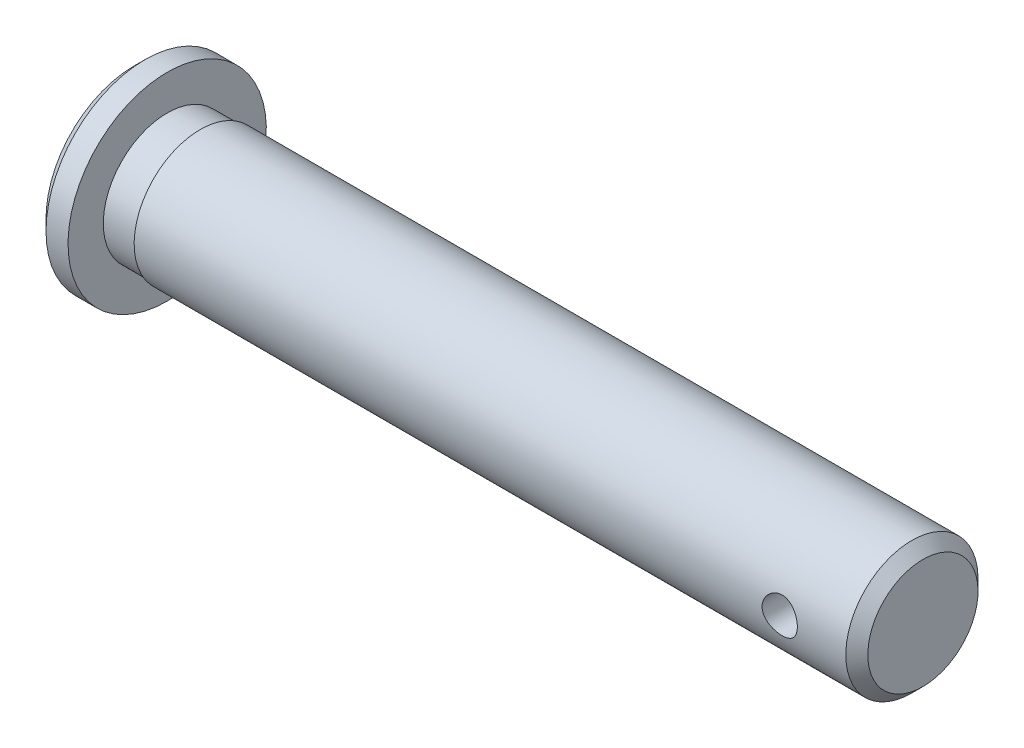
ISO-10303-21;
HEADER;
FILE_DESCRIPTION(('STEP AP214'),'2;1');
FILE_NAME('part.step','',(''),(''),'','','');
FILE_SCHEMA(('AUTOMOTIVE_DESIGN { 1 0 10303 214 1 1 1 1 }'));
ENDSEC;
DATA;
#1=APPLICATION_CONTEXT('core data for automotive mechanical design processes');
#2=APPLICATION_PROTOCOL_DEFINITION('international standard','automotive_design',2000,#1);
#3=PRODUCT_CONTEXT('',#1,'mechanical');
#4=PRODUCT('Part','Part','',(#3));
#5=PRODUCT_RELATED_PRODUCT_CATEGORY('part','',(#4));
#6=PRODUCT_DEFINITION_FORMATION('','',#4);
#7=PRODUCT_DEFINITION_CONTEXT('part definition',#1,'design');
#8=PRODUCT_DEFINITION('design','',#6,#7);
#9=PRODUCT_DEFINITION_SHAPE('','',#8);
#10=(LENGTH_UNIT() NAMED_UNIT(*) SI_UNIT(.MILLI.,.METRE.));
#11=(NAMED_UNIT(*) PLANE_ANGLE_UNIT() SI_UNIT($,.RADIAN.));
#12=(NAMED_UNIT(*) SI_UNIT($,.STERADIAN.) SOLID_ANGLE_UNIT());
#13=UNCERTAINTY_MEASURE_WITH_UNIT(LENGTH_MEASURE(1.E-05),#10,'distance_accuracy_value','');
#14=(GEOMETRIC_REPRESENTATION_CONTEXT(3) GLOBAL_UNCERTAINTY_ASSIGNED_CONTEXT((#13)) GLOBAL_UNIT_ASSIGNED_CONTEXT((#10,
#11,#12)) REPRESENTATION_CONTEXT('',''));
#15=CARTESIAN_POINT('',(0.,0.,0.));
#16=DIRECTION('',(0.,0.,1.));
#17=DIRECTION('',(1.,0.,0.));
#18=AXIS2_PLACEMENT_3D('',#15,#16,#17);
#19=CARTESIAN_POINT('',(-1.5,0.,0.));
#20=DIRECTION('',(1.,0.,0.));
#21=DIRECTION('',(0.,1.,0.));
#22=AXIS2_PLACEMENT_3D('',#19,#20,#21);
#23=PLANE('',#22);
#24=CARTESIAN_POINT('',(-1.5,0.,0.));
#25=DIRECTION('',(1.,0.,0.));
#26=DIRECTION('',(0.,1.,0.));
#27=AXIS2_PLACEMENT_3D('',#24,#25,#26);
#28=CIRCLE('',#27,4.);
#29=CARTESIAN_POINT('',(-1.5,4.,0.));
#30=VERTEX_POINT('',#29);
#31=EDGE_CURVE('E42',#30,#30,#28,.F.);
#32=ORIENTED_EDGE('',*,*,#31,.T.);
#33=EDGE_LOOP('',(#32));
#34=FACE_BOUND('',#33,.T.);
#35=ADVANCED_FACE('F35',(#34),#23,.F.);
#36=CARTESIAN_POINT('',(0.,0.,0.));
#37=DIRECTION('',(-1.,0.,0.));
#38=DIRECTION('',(0.,-1.,0.));
#39=AXIS2_PLACEMENT_3D('',#36,#37,#38);
#40=CYLINDRICAL_SURFACE('',#39,4.5);
#41=CARTESIAN_POINT('',(-1.,0.,0.));
#42=DIRECTION('',(1.,0.,0.));
#43=DIRECTION('',(0.,1.,0.));
#44=AXIS2_PLACEMENT_3D('',#41,#42,#43);
#45=CIRCLE('',#44,4.5);
#46=CARTESIAN_POINT('',(-1.,4.5,0.));
#47=VERTEX_POINT('',#46);
#48=EDGE_CURVE('E10',#47,#47,#45,.T.);
#49=ORIENTED_EDGE('',*,*,#48,.T.);
#50=EDGE_LOOP('',(#49));
#51=FACE_BOUND('',#50,.T.);
#52=CARTESIAN_POINT('',(0.,0.,0.));
#53=DIRECTION('',(-1.,0.,0.));
#54=DIRECTION('',(0.,-1.,0.));
#55=AXIS2_PLACEMENT_3D('',#52,#53,#54);
#56=CIRCLE('',#55,4.5);
#57=CARTESIAN_POINT('',(0.,-4.5,0.));
#58=VERTEX_POINT('',#57);
#59=EDGE_CURVE('E119',#58,#58,#56,.T.);
#60=ORIENTED_EDGE('',*,*,#59,.T.);
#61=EDGE_LOOP('',(#60));
#62=FACE_BOUND('',#61,.T.);
#63=ADVANCED_FACE('F86',(#51,#62),#40,.T.);
#64=CARTESIAN_POINT('',(0.,4.5,0.));
#65=DIRECTION('',(-1.,0.,0.));
#66=DIRECTION('',(0.,-1.,0.));
#67=AXIS2_PLACEMENT_3D('',#64,#65,#66);
#68=PLANE('',#67);
#69=ORIENTED_EDGE('',*,*,#59,.F.);
#70=EDGE_LOOP('',(#69));
#71=FACE_BOUND('',#70,.T.);
#72=CARTESIAN_POINT('',(0.,0.,0.));
#73=DIRECTION('',(-1.,0.,0.));
#74=DIRECTION('',(0.,-1.,0.));
#75=AXIS2_PLACEMENT_3D('',#72,#73,#74);
#76=CIRCLE('',#75,2.9);
#77=CARTESIAN_POINT('',(0.,-2.9,0.));
#78=VERTEX_POINT('',#77);
#79=EDGE_CURVE('E115',#78,#78,#76,.T.);
#80=ORIENTED_EDGE('',*,*,#79,.T.);
#81=EDGE_LOOP('',(#80));
#82=FACE_BOUND('',#81,.T.);
#83=ADVANCED_FACE('F91',(#71,#82),#68,.F.);
#84=CARTESIAN_POINT('',(0.,0.,0.));
#85=DIRECTION('',(-1.,0.,0.));
#86=DIRECTION('',(0.,-1.,0.));
#87=AXIS2_PLACEMENT_3D('',#84,#85,#86);
#88=CYLINDRICAL_SURFACE('',#87,2.9);
#89=ORIENTED_EDGE('',*,*,#79,.F.);
#90=EDGE_LOOP('',(#89));
#91=FACE_BOUND('',#90,.T.);
#92=CARTESIAN_POINT('',(1.5,0.,0.));
#93=DIRECTION('',(-1.,0.,0.));
#94=DIRECTION('',(0.,-1.,0.));
#95=AXIS2_PLACEMENT_3D('',#92,#93,#94);
#96=CIRCLE('',#95,2.9);
#97=CARTESIAN_POINT('',(1.5,-2.9,0.));
#98=VERTEX_POINT('',#97);
#99=EDGE_CURVE('E112',#98,#98,#96,.T.);
#100=ORIENTED_EDGE('',*,*,#99,.T.);
#101=EDGE_LOOP('',(#100));
#102=FACE_BOUND('',#101,.T.);
#103=ADVANCED_FACE('F126',(#91,#102),#88,.T.);
#104=CARTESIAN_POINT('',(1.5,2.9,0.));
#105=DIRECTION('',(1.,0.,0.));
#106=DIRECTION('',(0.,1.,0.));
#107=AXIS2_PLACEMENT_3D('',#104,#105,#106);
#108=PLANE('',#107);
#109=ORIENTED_EDGE('',*,*,#99,.F.);
#110=EDGE_LOOP('',(#109));
#111=FACE_BOUND('',#110,.T.);
#112=CARTESIAN_POINT('',(1.5,0.,0.));
#113=DIRECTION('',(-1.,0.,0.));
#114=DIRECTION('',(0.,-1.,0.));
#115=AXIS2_PLACEMENT_3D('',#112,#113,#114);
#116=CIRCLE('',#115,3.);
#117=CARTESIAN_POINT('',(1.5,-3.,0.));
#118=VERTEX_POINT('',#117);
#119=EDGE_CURVE('E63',#118,#118,#116,.T.);
#120=ORIENTED_EDGE('',*,*,#119,.T.);
#121=EDGE_LOOP('',(#120));
#122=FACE_BOUND('',#121,.T.);
#123=ADVANCED_FACE('F83',(#111,#122),#108,.F.);
#124=CARTESIAN_POINT('',(0.,0.,0.));
#125=DIRECTION('',(-1.,0.,0.));
#126=DIRECTION('',(0.,-1.,0.));
#127=AXIS2_PLACEMENT_3D('',#124,#125,#126);
#128=CYLINDRICAL_SURFACE('',#127,3.);
#129=CARTESIAN_POINT('',(33.8,0.,0.));
#130=DIRECTION('',(-1.,0.,0.));
#131=DIRECTION('',(0.,-1.,0.));
#132=AXIS2_PLACEMENT_3D('',#129,#130,#131);
#133=CIRCLE('',#132,3.);
#134=CARTESIAN_POINT('',(33.8,-3.,0.));
#135=VERTEX_POINT('',#134);
#136=EDGE_CURVE('E50',#135,#135,#133,.T.);
#137=ORIENTED_EDGE('',*,*,#136,.T.);
#138=EDGE_LOOP('',(#137));
#139=FACE_BOUND('',#138,.T.);
#140=CARTESIAN_POINT('',(31.6,0.,-3.));
#141=CARTESIAN_POINT('',(31.5999989532261,0.0441018223331418,-2.99999933524065));
#142=CARTESIAN_POINT('',(31.5963409543241,0.0882148640887363,-2.99901794464862));
#143=CARTESIAN_POINT('',(31.5818315077045,0.175170180541786,-2.99519829448663));
#144=CARTESIAN_POINT('',(31.5709765982296,0.218011833327636,-2.9923591413303));
#145=CARTESIAN_POINT('',(31.5424513332544,0.301156635618128,-2.98513733301121));
#146=CARTESIAN_POINT('',(31.5247897649336,0.341462980406118,-2.98075666852169));
#147=CARTESIAN_POINT('',(31.4831851029334,0.418541474557067,-2.97091479660652));
#148=CARTESIAN_POINT('',(31.4592415906563,0.455313388179853,-2.96545351718002));
#149=CARTESIAN_POINT('',(31.4051665934346,0.525131801496016,-2.95389845960869));
#150=CARTESIAN_POINT('',(31.3749165327966,0.558084675945132,-2.9477938707174));
#151=CARTESIAN_POINT('',(31.3093406067747,0.618514854642545,-2.93570963871569));
#152=CARTESIAN_POINT('',(31.2740140889533,0.645991453982621,-2.92973001177899));
#153=CARTESIAN_POINT('',(31.1985407060695,0.695145636973708,-2.91846214986765));
#154=CARTESIAN_POINT('',(31.1583214686941,0.716715510946115,-2.91318755429117));
#155=CARTESIAN_POINT('',(31.0746639555642,0.752750192307824,-2.90408590923454));
#156=CARTESIAN_POINT('',(31.0312262750719,0.767216309804888,-2.9002585928704));
#157=CARTESIAN_POINT('',(30.9434017848693,0.788307680905708,-2.89459646334927));
#158=CARTESIAN_POINT('',(30.8990585840191,0.795102680979751,-2.89271859176123));
#159=CARTESIAN_POINT('',(30.8098249266668,0.801188138824376,-2.89103932417876));
#160=CARTESIAN_POINT('',(30.7649345739857,0.800479998822949,-2.89123754019361));
#161=CARTESIAN_POINT('',(30.6772058338511,0.79171404001049,-2.89364951507618));
#162=CARTESIAN_POINT('',(30.6343451271848,0.783861624258981,-2.89580694201076));
#163=CARTESIAN_POINT('',(30.5505726662173,0.761358994888821,-2.90180405235812));
#164=CARTESIAN_POINT('',(30.5096610679698,0.746708237972008,-2.90564387021998));
#165=CARTESIAN_POINT('',(30.4304127424766,0.710857427861006,-2.91462264698391));
#166=CARTESIAN_POINT('',(30.3921102642855,0.689585364551136,-2.91977577127223));
#167=CARTESIAN_POINT('',(30.3195463364594,0.641146015295121,-2.93079291857236));
#168=CARTESIAN_POINT('',(30.2852856843374,0.613977568897012,-2.93665708142145));
#169=CARTESIAN_POINT('',(30.2206044010181,0.553466429053678,-2.94867004251873));
#170=CARTESIAN_POINT('',(30.190345472674,0.5199512509132,-2.95482188595513));
#171=CARTESIAN_POINT('',(30.1358444878599,0.448247067282552,-2.96654552510546));
#172=CARTESIAN_POINT('',(30.111602668519,0.410057877682038,-2.97211729795427));
#173=CARTESIAN_POINT('',(30.0697528388701,0.329839302198981,-2.98208728159312));
#174=CARTESIAN_POINT('',(30.0521740918206,0.287793961020717,-2.98648029133423));
#175=CARTESIAN_POINT('',(30.0243811244746,0.20120091775616,-2.99356017760401));
#176=CARTESIAN_POINT('',(30.0141652949104,0.15665376477133,-2.996247426935));
#177=CARTESIAN_POINT('',(30.0016420492329,0.067701633258206,-2.99955663423354));
#178=CARTESIAN_POINT('',(29.9991147840596,0.0233296950565515,-3.00023598988385));
#179=CARTESIAN_POINT('',(30.0014332656988,-0.0652040183604805,-2.99961788676677));
#180=CARTESIAN_POINT('',(30.0062782504423,-0.109365814824846,-2.99832063232137));
#181=CARTESIAN_POINT('',(30.023023378984,-0.195440979960715,-2.99393214198412));
#182=CARTESIAN_POINT('',(30.0348008984791,-0.237379940811119,-2.99087210618547));
#183=CARTESIAN_POINT('',(30.0649343778032,-0.318682788470426,-2.98330517957641));
#184=CARTESIAN_POINT('',(30.0832910505002,-0.358046395686402,-2.9787981319841));
#185=CARTESIAN_POINT('',(30.1264695548722,-0.433935389867197,-2.96870264223867));
#186=CARTESIAN_POINT('',(30.1514109867192,-0.470390075384524,-2.96309474642193));
#187=CARTESIAN_POINT('',(30.2069006520631,-0.538673854158816,-2.95144580946015));
#188=CARTESIAN_POINT('',(30.2374499930399,-0.570502031519501,-2.94540468290222));
#189=CARTESIAN_POINT('',(30.3043142309983,-0.62955569791528,-2.9333589834749));
#190=CARTESIAN_POINT('',(30.3407674245601,-0.656626076999949,-2.92736024574782));
#191=CARTESIAN_POINT('',(30.4178258784379,-0.7042687647398,-2.91626578870035));
#192=CARTESIAN_POINT('',(30.4584309654415,-0.724841344486113,-2.91117003171109));
#193=CARTESIAN_POINT('',(30.5424381228353,-0.75874964634595,-2.9025170736066));
#194=CARTESIAN_POINT('',(30.5858223247492,-0.772127249023596,-2.89895099369493));
#195=CARTESIAN_POINT('',(30.6743357278935,-0.791364820483178,-2.89375930092876));
#196=CARTESIAN_POINT('',(30.7194644801468,-0.797226710411958,-2.89213319219128));
#197=CARTESIAN_POINT('',(30.808597915149,-0.801155958613018,-2.89104697818674));
#198=CARTESIAN_POINT('',(30.8525909281021,-0.799472622471947,-2.89151759094413));
#199=CARTESIAN_POINT('',(30.9396414056052,-0.788937504002255,-2.89440958435318));
#200=CARTESIAN_POINT('',(30.9826988942006,-0.780085906140239,-2.89683091480545));
#201=CARTESIAN_POINT('',(31.0663423008516,-0.755610062798671,-2.903310284285));
#202=CARTESIAN_POINT('',(31.1069447370928,-0.740038644302289,-2.90735554007653));
#203=CARTESIAN_POINT('',(31.1849915322137,-0.702606218249584,-2.91662727254676));
#204=CARTESIAN_POINT('',(31.2224353945202,-0.680744224098481,-2.92185393448601));
#205=CARTESIAN_POINT('',(31.2942921437986,-0.630595637075262,-2.93309168576127));
#206=CARTESIAN_POINT('',(31.3285834139905,-0.602138919071638,-2.93912133240661));
#207=CARTESIAN_POINT('',(31.3919849806669,-0.539932214044405,-2.95118201513218));
#208=CARTESIAN_POINT('',(31.4210940154675,-0.506180941743502,-2.95721305119381));
#209=CARTESIAN_POINT('',(31.4739168950587,-0.433471992435476,-2.96875124961583));
#210=CARTESIAN_POINT('',(31.4975020042597,-0.394418384700713,-2.97424444525819));
#211=CARTESIAN_POINT('',(31.5377349663718,-0.312755456166756,-2.9839352404116));
#212=CARTESIAN_POINT('',(31.5543872702654,-0.270148437878518,-2.98813367073438));
#213=CARTESIAN_POINT('',(31.5781101141662,-0.189749881952395,-2.99421901005387));
#214=CARTESIAN_POINT('',(31.586299753437,-0.152304806626013,-2.99637108237041));
#215=CARTESIAN_POINT('',(31.5972448824668,-0.07657591812683,-2.99926179614582));
#216=CARTESIAN_POINT('',(31.60000090888,-0.0382921881619439,-3.00000057718908));
#217=CARTESIAN_POINT('',(31.6,0.,-3.));
#218=B_SPLINE_CURVE_WITH_KNOTS('',3,(#140,#141,#142,#143,#144,#145,#146,#147,#148,#149,#150,
#151,#152,#153,#154,#155,#156,#157,#158,#159,#160,#161,#162,#163,#164,#165,#166,#167,#168,#169,
#170,#171,#172,#173,#174,#175,#176,#177,#178,#179,#180,#181,#182,#183,#184,#185,#186,#187,#188,
#189,#190,#191,#192,#193,#194,#195,#196,#197,#198,#199,#200,#201,#202,#203,#204,#205,#206,#207,
#208,#209,#210,#211,#212,#213,#214,#215,#216,#217),.UNSPECIFIED.,.T.,.F.,(4,2,2,2,2,2,2,2,2,2,2,
2,2,2,2,2,2,2,2,2,2,2,2,2,2,2,2,2,2,2,2,2,2,2,2,2,2,2,4),(0.,0.132165039579828,
0.264393697504582,0.396452221188776,0.528519546834705,0.663339591819877,0.7981769797006,
0.935330330092926,1.07245837651881,1.20648863299037,1.34049384159395,1.47076400816065,
1.60104458722843,1.73279469336266,1.86457075244719,2.00064503922596,2.13672468772706,
2.27339523838884,2.41003590873723,2.54273087007487,2.67541211567808,2.80581414254514,
2.93623030307914,3.06920114399488,3.20219827301223,3.33894598550784,3.47568799207311,
3.61162519076598,3.74752763461534,3.87897336957385,4.01041572204179,4.14084306175262,
4.27129086845142,4.40557735824497,4.5398964972892,4.677089009083,4.81419330454013,
4.92895927593276,5.04371391182494),.UNSPECIFIED.);
#219=CARTESIAN_POINT('',(31.6,0.,-3.));
#220=VERTEX_POINT('',#219);
#221=EDGE_CURVE('E56',#220,#220,#218,.T.);
#222=ORIENTED_EDGE('',*,*,#221,.T.);
#223=EDGE_LOOP('',(#222));
#224=FACE_BOUND('',#223,.T.);
#225=CARTESIAN_POINT('',(31.6,0.,3.));
#226=CARTESIAN_POINT('',(31.5999989532261,-0.044101822333143,2.99999933524065));
#227=CARTESIAN_POINT('',(31.5963409543241,-0.0882148640887375,2.99901794464862));
#228=CARTESIAN_POINT('',(31.5818315077045,-0.175170180541788,2.99519829448663));
#229=CARTESIAN_POINT('',(31.5709765982296,-0.218011833327638,2.9923591413303));
#230=CARTESIAN_POINT('',(31.5424513332544,-0.301156635618129,2.98513733301121));
#231=CARTESIAN_POINT('',(31.5247897649336,-0.341462980406119,2.98075666852169));
#232=CARTESIAN_POINT('',(31.4831851029334,-0.418541474557068,2.97091479660652));
#233=CARTESIAN_POINT('',(31.4592415906563,-0.455313388179853,2.96545351718002));
#234=CARTESIAN_POINT('',(31.4051665934346,-0.525131801496017,2.95389845960869));
#235=CARTESIAN_POINT('',(31.3749165327966,-0.558084675945133,2.9477938707174));
#236=CARTESIAN_POINT('',(31.3093406067747,-0.618514854642547,2.93570963871569));
#237=CARTESIAN_POINT('',(31.2740140889533,-0.645991453982624,2.92973001177898));
#238=CARTESIAN_POINT('',(31.1985407060695,-0.69514563697371,2.91846214986764));
#239=CARTESIAN_POINT('',(31.1583214686941,-0.716715510946116,2.91318755429117));
#240=CARTESIAN_POINT('',(31.0746639555642,-0.752750192307824,2.90408590923454));
#241=CARTESIAN_POINT('',(31.0312262750719,-0.767216309804887,2.9002585928704));
#242=CARTESIAN_POINT('',(30.9434017848693,-0.788307680905707,2.89459646334927));
#243=CARTESIAN_POINT('',(30.8990585840191,-0.795102680979751,2.89271859176123));
#244=CARTESIAN_POINT('',(30.8098249266668,-0.801188138824376,2.89103932417876));
#245=CARTESIAN_POINT('',(30.7649345739857,-0.80047999882295,2.89123754019361));
#246=CARTESIAN_POINT('',(30.6772058338511,-0.79171404001049,2.89364951507618));
#247=CARTESIAN_POINT('',(30.6343451271848,-0.783861624258981,2.89580694201076));
#248=CARTESIAN_POINT('',(30.5505726662173,-0.761358994888821,2.90180405235812));
#249=CARTESIAN_POINT('',(30.5096610679698,-0.746708237972008,2.90564387021998));
#250=CARTESIAN_POINT('',(30.4304127424766,-0.710857427861006,2.91462264698391));
#251=CARTESIAN_POINT('',(30.3921102642855,-0.689585364551136,2.91977577127223));
#252=CARTESIAN_POINT('',(30.3195463364594,-0.64114601529512,2.93079291857236));
#253=CARTESIAN_POINT('',(30.2852856843374,-0.61397756889701,2.93665708142145));
#254=CARTESIAN_POINT('',(30.2206044010181,-0.553466429053675,2.94867004251873));
#255=CARTESIAN_POINT('',(30.190345472674,-0.519951250913196,2.95482188595513));
#256=CARTESIAN_POINT('',(30.1358444878599,-0.44824706728255,2.96654552510546));
#257=CARTESIAN_POINT('',(30.111602668519,-0.410057877682037,2.97211729795427));
#258=CARTESIAN_POINT('',(30.0697528388701,-0.329839302198981,2.98208728159312));
#259=CARTESIAN_POINT('',(30.0521740918206,-0.287793961020715,2.98648029133423));
#260=CARTESIAN_POINT('',(30.0243811244746,-0.201200917756157,2.99356017760401));
#261=CARTESIAN_POINT('',(30.0141652949104,-0.156653764771328,2.996247426935));
#262=CARTESIAN_POINT('',(30.0016420492329,-0.0677016332582041,2.99955663423354));
#263=CARTESIAN_POINT('',(29.9991147840596,-0.0233296950565494,3.00023598988385));
#264=CARTESIAN_POINT('',(30.0014332656988,0.0652040183604825,2.99961788676677));
#265=CARTESIAN_POINT('',(30.0062782504423,0.109365814824848,2.99832063232137));
#266=CARTESIAN_POINT('',(30.023023378984,0.195440979960717,2.99393214198412));
#267=CARTESIAN_POINT('',(30.0348008984791,0.237379940811121,2.99087210618547));
#268=CARTESIAN_POINT('',(30.0649343778032,0.318682788470428,2.98330517957641));
#269=CARTESIAN_POINT('',(30.0832910505002,0.358046395686404,2.9787981319841));
#270=CARTESIAN_POINT('',(30.1264695548722,0.433935389867198,2.96870264223867));
#271=CARTESIAN_POINT('',(30.1514109867192,0.470390075384525,2.96309474642193));
#272=CARTESIAN_POINT('',(30.2069006520631,0.538673854158818,2.95144580946015));
#273=CARTESIAN_POINT('',(30.2374499930399,0.570502031519503,2.94540468290222));
#274=CARTESIAN_POINT('',(30.3043142309983,0.629555697915281,2.9333589834749));
#275=CARTESIAN_POINT('',(30.3407674245601,0.65662607699995,2.92736024574781));
#276=CARTESIAN_POINT('',(30.4178258784379,0.7042687647398,2.91626578870034));
#277=CARTESIAN_POINT('',(30.4584309654415,0.724841344486114,2.91117003171109));
#278=CARTESIAN_POINT('',(30.5424381228353,0.75874964634595,2.9025170736066));
#279=CARTESIAN_POINT('',(30.5858223247492,0.772127249023596,2.89895099369493));
#280=CARTESIAN_POINT('',(30.6743357278935,0.791364820483178,2.89375930092876));
#281=CARTESIAN_POINT('',(30.7194644801468,0.797226710411958,2.89213319219128));
#282=CARTESIAN_POINT('',(30.808597915149,0.801155958613018,2.89104697818674));
#283=CARTESIAN_POINT('',(30.8525909281021,0.799472622471946,2.89151759094413));
#284=CARTESIAN_POINT('',(30.9396414056052,0.788937504002255,2.89440958435317));
#285=CARTESIAN_POINT('',(30.9826988942006,0.780085906140239,2.89683091480545));
#286=CARTESIAN_POINT('',(31.0663423008516,0.755610062798671,2.903310284285));
#287=CARTESIAN_POINT('',(31.1069447370928,0.740038644302289,2.90735554007653));
#288=CARTESIAN_POINT('',(31.1849915322137,0.702606218249583,2.91662727254676));
#289=CARTESIAN_POINT('',(31.2224353945202,0.680744224098481,2.92185393448601));
#290=CARTESIAN_POINT('',(31.2942921437986,0.630595637075262,2.93309168576127));
#291=CARTESIAN_POINT('',(31.3285834139905,0.602138919071638,2.93912133240661));
#292=CARTESIAN_POINT('',(31.3919849806669,0.539932214044402,2.95118201513218));
#293=CARTESIAN_POINT('',(31.4210940154675,0.506180941743496,2.95721305119381));
#294=CARTESIAN_POINT('',(31.4739168950587,0.433471992435468,2.96875124961583));
#295=CARTESIAN_POINT('',(31.4975020042597,0.394418384700707,2.97424444525819));
#296=CARTESIAN_POINT('',(31.5377349663718,0.312755456166753,2.9839352404116));
#297=CARTESIAN_POINT('',(31.5543872702654,0.270148437878516,2.98813367073438));
#298=CARTESIAN_POINT('',(31.5781101141662,0.189749881952394,2.99421901005387));
#299=CARTESIAN_POINT('',(31.586299753437,0.152304806626012,2.99637108237041));
#300=CARTESIAN_POINT('',(31.5972448824668,0.0765759181268288,2.99926179614582));
#301=CARTESIAN_POINT('',(31.60000090888,0.0382921881619427,3.00000057718908));
#302=CARTESIAN_POINT('',(31.6,0.,3.));
#303=B_SPLINE_CURVE_WITH_KNOTS('',3,(#225,#226,#227,#228,#229,#230,#231,#232,#233,#234,#235,
#236,#237,#238,#239,#240,#241,#242,#243,#244,#245,#246,#247,#248,#249,#250,#251,#252,#253,#254,
#255,#256,#257,#258,#259,#260,#261,#262,#263,#264,#265,#266,#267,#268,#269,#270,#271,#272,#273,
#274,#275,#276,#277,#278,#279,#280,#281,#282,#283,#284,#285,#286,#287,#288,#289,#290,#291,#292,
#293,#294,#295,#296,#297,#298,#299,#300,#301,#302),.UNSPECIFIED.,.T.,.F.,(4,2,2,2,2,2,2,2,2,2,2,
2,2,2,2,2,2,2,2,2,2,2,2,2,2,2,2,2,2,2,2,2,2,2,2,2,2,2,4),(0.,0.132165039579828,
0.264393697504583,0.396452221188776,0.528519546834704,0.663339591819877,0.798176979700607,
0.935330330092925,1.07245837651881,1.20648863299036,1.34049384159395,1.47076400816065,
1.60104458722843,1.73279469336266,1.8645707524472,2.00064503922596,2.13672468772706,
2.27339523838884,2.41003590873723,2.54273087007487,2.67541211567808,2.80581414254514,
2.93623030307914,3.06920114399488,3.20219827301223,3.33894598550784,3.47568799207311,
3.61162519076598,3.74752763461533,3.87897336957385,4.01041572204178,4.14084306175262,
4.27129086845142,4.40557735824497,4.53989649728921,4.677089009083,4.81419330454013,
4.92895927593276,5.04371391182494),.UNSPECIFIED.);
#304=CARTESIAN_POINT('',(31.6,0.,3.));
#305=VERTEX_POINT('',#304);
#306=EDGE_CURVE('E55',#305,#305,#303,.T.);
#307=ORIENTED_EDGE('',*,*,#306,.T.);
#308=EDGE_LOOP('',(#307));
#309=FACE_BOUND('',#308,.T.);
#310=ORIENTED_EDGE('',*,*,#119,.F.);
#311=EDGE_LOOP('',(#310));
#312=FACE_BOUND('',#311,.T.);
#313=ADVANCED_FACE('F67',(#139,#224,#309,#312),#128,.T.);
#314=CARTESIAN_POINT('',(34.3,3.,0.));
#315=DIRECTION('',(-1.,0.,0.));
#316=DIRECTION('',(0.,-1.,0.));
#317=AXIS2_PLACEMENT_3D('',#314,#315,#316);
#318=PLANE('',#317);
#319=CARTESIAN_POINT('',(34.3,0.,0.));
#320=DIRECTION('',(-1.,0.,0.));
#321=DIRECTION('',(0.,-1.,0.));
#322=AXIS2_PLACEMENT_3D('',#319,#320,#321);
#323=CIRCLE('',#322,2.5);
#324=CARTESIAN_POINT('',(34.3,-2.5,0.));
#325=VERTEX_POINT('',#324);
#326=EDGE_CURVE('E46',#325,#325,#323,.F.);
#327=ORIENTED_EDGE('',*,*,#326,.T.);
#328=EDGE_LOOP('',(#327));
#329=FACE_BOUND('',#328,.T.);
#330=ADVANCED_FACE('F75',(#329),#318,.F.);
#331=CARTESIAN_POINT('',(30.8,0.,-4.5));
#332=DIRECTION('',(0.,0.,1.));
#333=DIRECTION('',(1.,0.,0.));
#334=AXIS2_PLACEMENT_3D('',#331,#332,#333);
#335=CYLINDRICAL_SURFACE('',#334,0.800000000000006);
#336=ORIENTED_EDGE('',*,*,#221,.F.);
#337=EDGE_LOOP('',(#336));
#338=FACE_BOUND('',#337,.T.);
#339=ORIENTED_EDGE('',*,*,#306,.F.);
#340=EDGE_LOOP('',(#339));
#341=FACE_BOUND('',#340,.T.);
#342=ADVANCED_FACE('F71',(#338,#341),#335,.F.);
#343=CARTESIAN_POINT('',(33.8,0.,0.));
#344=DIRECTION('',(-1.,0.,0.));
#345=DIRECTION('',(0.,-1.,0.));
#346=AXIS2_PLACEMENT_3D('',#343,#344,#345);
#347=CONICAL_SURFACE('',#346,3.,0.785398163397447);
#348=ORIENTED_EDGE('',*,*,#326,.F.);
#349=EDGE_LOOP('',(#348));
#350=FACE_BOUND('',#349,.T.);
#351=ORIENTED_EDGE('',*,*,#136,.F.);
#352=EDGE_LOOP('',(#351));
#353=FACE_BOUND('',#352,.T.);
#354=ADVANCED_FACE('F74',(#350,#353),#347,.T.);
#355=CARTESIAN_POINT('',(-1.5,0.,0.));
#356=DIRECTION('',(1.,0.,0.));
#357=DIRECTION('',(0.,1.,0.));
#358=AXIS2_PLACEMENT_3D('',#355,#356,#357);
#359=CONICAL_SURFACE('',#358,4.,0.785398163397447);
#360=ORIENTED_EDGE('',*,*,#48,.F.);
#361=EDGE_LOOP('',(#360));
#362=FACE_BOUND('',#361,.T.);
#363=ORIENTED_EDGE('',*,*,#31,.F.);
#364=EDGE_LOOP('',(#363));
#365=FACE_BOUND('',#364,.T.);
#366=ADVANCED_FACE('F37',(#362,#365),#359,.T.);
#367=CLOSED_SHELL('',(#35,#63,#83,#103,#123,#313,#330,#342,#354,#366));
#368=MANIFOLD_SOLID_BREP('B2',#367);
#369=ADVANCED_BREP_SHAPE_REPRESENTATION('',(#18,#368),#14);
#370=SHAPE_DEFINITION_REPRESENTATION(#9,#369);
ENDSEC;
END-ISO-10303-21;
